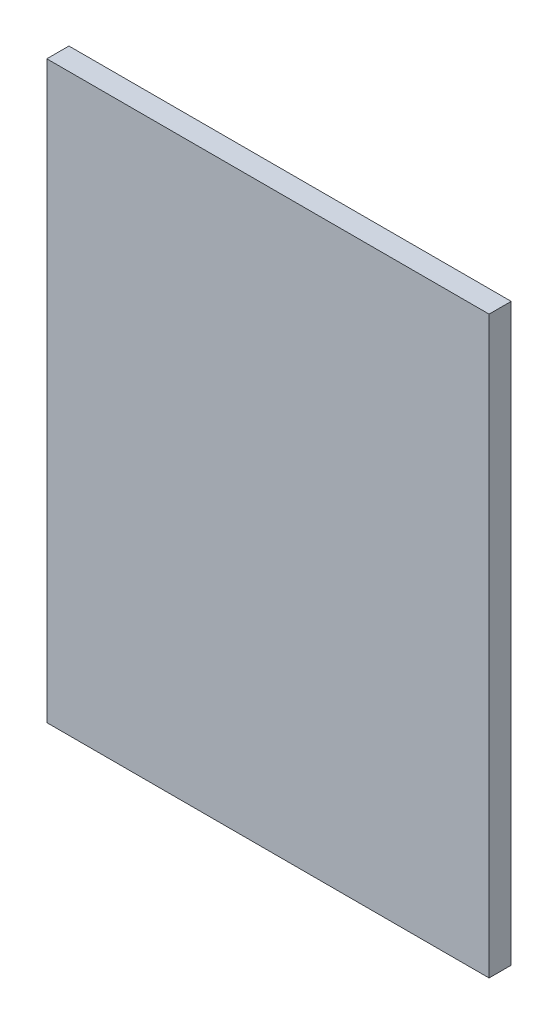
ISO-10303-21;
HEADER;
FILE_DESCRIPTION(('STEP AP214'),'2;1');
FILE_NAME('part.step','',(''),(''),'','','');
FILE_SCHEMA(('AUTOMOTIVE_DESIGN { 1 0 10303 214 1 1 1 1 }'));
ENDSEC;
DATA;
#1=APPLICATION_CONTEXT('core data for automotive mechanical design processes');
#2=APPLICATION_PROTOCOL_DEFINITION('international standard','automotive_design',2000,#1);
#3=PRODUCT_CONTEXT('',#1,'mechanical');
#4=PRODUCT('Part','Part','',(#3));
#5=PRODUCT_RELATED_PRODUCT_CATEGORY('part','',(#4));
#6=PRODUCT_DEFINITION_FORMATION('','',#4);
#7=PRODUCT_DEFINITION_CONTEXT('part definition',#1,'design');
#8=PRODUCT_DEFINITION('design','',#6,#7);
#9=PRODUCT_DEFINITION_SHAPE('','',#8);
#10=(LENGTH_UNIT() NAMED_UNIT(*) SI_UNIT(.MILLI.,.METRE.));
#11=(NAMED_UNIT(*) PLANE_ANGLE_UNIT() SI_UNIT($,.RADIAN.));
#12=(NAMED_UNIT(*) SI_UNIT($,.STERADIAN.) SOLID_ANGLE_UNIT());
#13=UNCERTAINTY_MEASURE_WITH_UNIT(LENGTH_MEASURE(1.E-05),#10,'distance_accuracy_value','');
#14=(GEOMETRIC_REPRESENTATION_CONTEXT(3) GLOBAL_UNCERTAINTY_ASSIGNED_CONTEXT((#13)) GLOBAL_UNIT_ASSIGNED_CONTEXT((#10,
#11,#12)) REPRESENTATION_CONTEXT('',''));
#15=CARTESIAN_POINT('',(0.,0.,0.));
#16=DIRECTION('',(0.,0.,1.));
#17=DIRECTION('',(1.,0.,0.));
#18=AXIS2_PLACEMENT_3D('',#15,#16,#17);
#19=CARTESIAN_POINT('',(-33.4865900383142,51.6858237547893,5.));
#20=DIRECTION('',(1.,0.,0.));
#21=DIRECTION('',(0.,1.,0.));
#22=AXIS2_PLACEMENT_3D('',#19,#20,#21);
#23=PLANE('',#22);
#24=DIRECTION('',(0.,-1.,0.));
#25=VECTOR('',#24,1.);
#26=CARTESIAN_POINT('',(-33.4865900383142,51.6858237547893,0.));
#27=LINE('',#26,#25);
#28=CARTESIAN_POINT('',(-33.4865900383142,51.6858237547893,0.));
#29=VERTEX_POINT('',#28);
#30=CARTESIAN_POINT('',(-33.4865900383142,-78.3141762452107,0.));
#31=VERTEX_POINT('',#30);
#32=EDGE_CURVE('E103',#29,#31,#27,.T.);
#33=ORIENTED_EDGE('',*,*,#32,.T.);
#34=DIRECTION('',(0.,0.,-1.));
#35=VECTOR('',#34,1.);
#36=CARTESIAN_POINT('',(-33.4865900383142,-78.3141762452107,5.));
#37=LINE('',#36,#35);
#38=CARTESIAN_POINT('',(-33.4865900383142,-78.3141762452107,5.));
#39=VERTEX_POINT('',#38);
#40=EDGE_CURVE('E11',#39,#31,#37,.T.);
#41=ORIENTED_EDGE('',*,*,#40,.F.);
#42=DIRECTION('',(0.,-1.,0.));
#43=VECTOR('',#42,1.);
#44=CARTESIAN_POINT('',(-33.4865900383142,51.6858237547893,5.));
#45=LINE('',#44,#43);
#46=CARTESIAN_POINT('',(-33.4865900383142,51.6858237547893,5.));
#47=VERTEX_POINT('',#46);
#48=EDGE_CURVE('E91',#47,#39,#45,.T.);
#49=ORIENTED_EDGE('',*,*,#48,.F.);
#50=DIRECTION('',(0.,0.,-1.));
#51=VECTOR('',#50,1.);
#52=CARTESIAN_POINT('',(-33.4865900383142,51.6858237547893,5.));
#53=LINE('',#52,#51);
#54=EDGE_CURVE('E99',#47,#29,#53,.T.);
#55=ORIENTED_EDGE('',*,*,#54,.T.);
#56=EDGE_LOOP('',(#33,#41,#49,#55));
#57=FACE_BOUND('',#56,.T.);
#58=ADVANCED_FACE('F40',(#57),#23,.F.);
#59=CARTESIAN_POINT('',(-33.4865900383142,-78.3141762452107,5.));
#60=DIRECTION('',(0.,1.,0.));
#61=DIRECTION('',(0.,0.,1.));
#62=AXIS2_PLACEMENT_3D('',#59,#60,#61);
#63=PLANE('',#62);
#64=DIRECTION('',(1.,0.,0.));
#65=VECTOR('',#64,1.);
#66=CARTESIAN_POINT('',(-33.4865900383142,-78.3141762452107,0.));
#67=LINE('',#66,#65);
#68=CARTESIAN_POINT('',(66.5134099616858,-78.3141762452107,0.));
#69=VERTEX_POINT('',#68);
#70=EDGE_CURVE('E95',#31,#69,#67,.T.);
#71=ORIENTED_EDGE('',*,*,#70,.T.);
#72=DIRECTION('',(0.,0.,-1.));
#73=VECTOR('',#72,1.);
#74=CARTESIAN_POINT('',(66.5134099616858,-78.3141762452107,5.));
#75=LINE('',#74,#73);
#76=CARTESIAN_POINT('',(66.5134099616858,-78.3141762452107,5.));
#77=VERTEX_POINT('',#76);
#78=EDGE_CURVE('E48',#77,#69,#75,.T.);
#79=ORIENTED_EDGE('',*,*,#78,.F.);
#80=DIRECTION('',(1.,0.,0.));
#81=VECTOR('',#80,1.);
#82=CARTESIAN_POINT('',(-33.4865900383142,-78.3141762452107,5.));
#83=LINE('',#82,#81);
#84=EDGE_CURVE('E86',#39,#77,#83,.T.);
#85=ORIENTED_EDGE('',*,*,#84,.F.);
#86=ORIENTED_EDGE('',*,*,#40,.T.);
#87=EDGE_LOOP('',(#71,#79,#85,#86));
#88=FACE_BOUND('',#87,.T.);
#89=ADVANCED_FACE('F94',(#88),#63,.F.);
#90=CARTESIAN_POINT('',(66.5134099616858,51.6858237547893,5.));
#91=DIRECTION('',(-1.,0.,0.));
#92=DIRECTION('',(0.,-1.,0.));
#93=AXIS2_PLACEMENT_3D('',#90,#91,#92);
#94=PLANE('',#93);
#95=DIRECTION('',(0.,1.,0.));
#96=VECTOR('',#95,1.);
#97=CARTESIAN_POINT('',(66.5134099616858,51.6858237547893,0.));
#98=LINE('',#97,#96);
#99=CARTESIAN_POINT('',(66.5134099616858,51.6858237547893,0.));
#100=VERTEX_POINT('',#99);
#101=EDGE_CURVE('E73',#69,#100,#98,.T.);
#102=ORIENTED_EDGE('',*,*,#101,.T.);
#103=DIRECTION('',(0.,0.,-1.));
#104=VECTOR('',#103,1.);
#105=CARTESIAN_POINT('',(66.5134099616858,51.6858237547893,5.));
#106=LINE('',#105,#104);
#107=CARTESIAN_POINT('',(66.5134099616858,51.6858237547893,5.));
#108=VERTEX_POINT('',#107);
#109=EDGE_CURVE('E96',#108,#100,#106,.T.);
#110=ORIENTED_EDGE('',*,*,#109,.F.);
#111=DIRECTION('',(0.,1.,0.));
#112=VECTOR('',#111,1.);
#113=CARTESIAN_POINT('',(66.5134099616858,51.6858237547893,5.));
#114=LINE('',#113,#112);
#115=EDGE_CURVE('E89',#77,#108,#114,.T.);
#116=ORIENTED_EDGE('',*,*,#115,.F.);
#117=ORIENTED_EDGE('',*,*,#78,.T.);
#118=EDGE_LOOP('',(#102,#110,#116,#117));
#119=FACE_BOUND('',#118,.T.);
#120=ADVANCED_FACE('F97',(#119),#94,.F.);
#121=CARTESIAN_POINT('',(-33.4865900383142,51.6858237547893,5.));
#122=DIRECTION('',(0.,-1.,0.));
#123=DIRECTION('',(0.,0.,-1.));
#124=AXIS2_PLACEMENT_3D('',#121,#122,#123);
#125=PLANE('',#124);
#126=DIRECTION('',(-1.,0.,0.));
#127=VECTOR('',#126,1.);
#128=CARTESIAN_POINT('',(-33.4865900383142,51.6858237547893,0.));
#129=LINE('',#128,#127);
#130=EDGE_CURVE('E79',#100,#29,#129,.T.);
#131=ORIENTED_EDGE('',*,*,#130,.T.);
#132=ORIENTED_EDGE('',*,*,#54,.F.);
#133=DIRECTION('',(-1.,0.,0.));
#134=VECTOR('',#133,1.);
#135=CARTESIAN_POINT('',(-33.4865900383142,51.6858237547893,5.));
#136=LINE('',#135,#134);
#137=EDGE_CURVE('E56',#108,#47,#136,.T.);
#138=ORIENTED_EDGE('',*,*,#137,.F.);
#139=ORIENTED_EDGE('',*,*,#109,.T.);
#140=EDGE_LOOP('',(#131,#132,#138,#139));
#141=FACE_BOUND('',#140,.T.);
#142=ADVANCED_FACE('F110',(#141),#125,.F.);
#143=CARTESIAN_POINT('',(0.,0.,5.));
#144=DIRECTION('',(0.,0.,1.));
#145=DIRECTION('',(1.,0.,0.));
#146=AXIS2_PLACEMENT_3D('',#143,#144,#145);
#147=PLANE('',#146);
#148=ORIENTED_EDGE('',*,*,#48,.T.);
#149=ORIENTED_EDGE('',*,*,#84,.T.);
#150=ORIENTED_EDGE('',*,*,#115,.T.);
#151=ORIENTED_EDGE('',*,*,#137,.T.);
#152=EDGE_LOOP('',(#148,#149,#150,#151));
#153=FACE_BOUND('',#152,.T.);
#154=ADVANCED_FACE('F87',(#153),#147,.T.);
#155=CARTESIAN_POINT('',(0.,0.,0.));
#156=DIRECTION('',(0.,0.,1.));
#157=DIRECTION('',(1.,0.,0.));
#158=AXIS2_PLACEMENT_3D('',#155,#156,#157);
#159=PLANE('',#158);
#160=ORIENTED_EDGE('',*,*,#32,.F.);
#161=ORIENTED_EDGE('',*,*,#130,.F.);
#162=ORIENTED_EDGE('',*,*,#101,.F.);
#163=ORIENTED_EDGE('',*,*,#70,.F.);
#164=EDGE_LOOP('',(#160,#161,#162,#163));
#165=FACE_BOUND('',#164,.T.);
#166=ADVANCED_FACE('F113',(#165),#159,.F.);
#167=CLOSED_SHELL('',(#58,#89,#120,#142,#154,#166));
#168=MANIFOLD_SOLID_BREP('B2',#167);
#169=ADVANCED_BREP_SHAPE_REPRESENTATION('',(#18,#168),#14);
#170=SHAPE_DEFINITION_REPRESENTATION(#9,#169);
ENDSEC;
END-ISO-10303-21;
